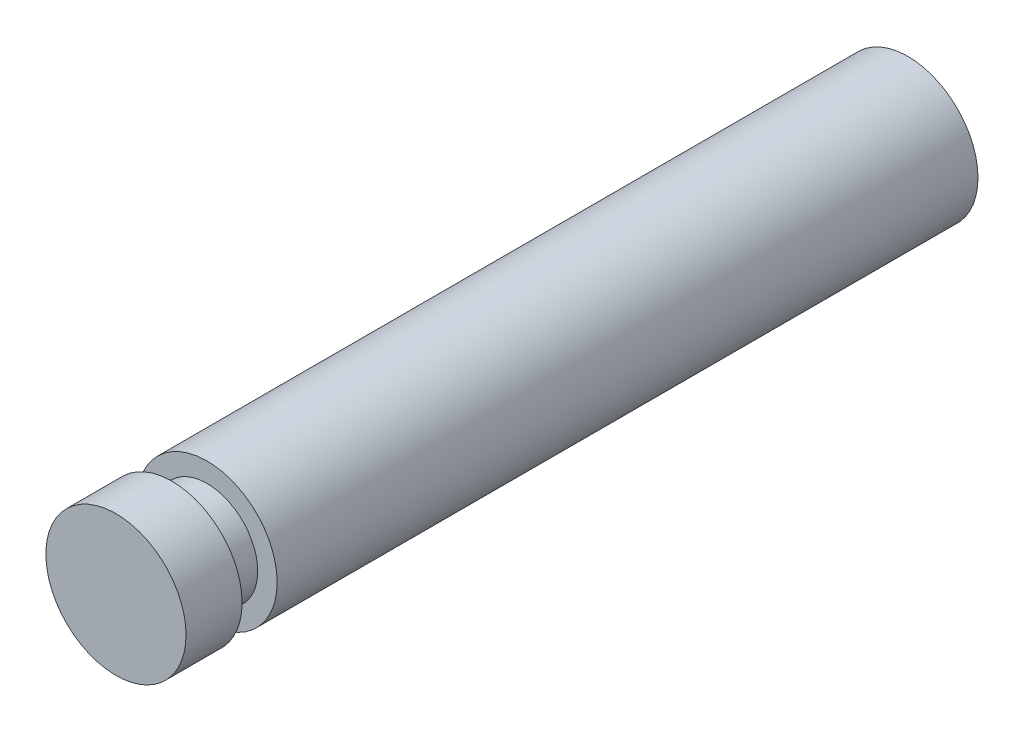
ISO-10303-21;
HEADER;
FILE_DESCRIPTION(('STEP AP214'),'2;1');
FILE_NAME('part.step','',(''),(''),'','','');
FILE_SCHEMA(('AUTOMOTIVE_DESIGN { 1 0 10303 214 1 1 1 1 }'));
ENDSEC;
DATA;
#1=APPLICATION_CONTEXT('core data for automotive mechanical design processes');
#2=APPLICATION_PROTOCOL_DEFINITION('international standard','automotive_design',2000,#1);
#3=PRODUCT_CONTEXT('',#1,'mechanical');
#4=PRODUCT('Part','Part','',(#3));
#5=PRODUCT_RELATED_PRODUCT_CATEGORY('part','',(#4));
#6=PRODUCT_DEFINITION_FORMATION('','',#4);
#7=PRODUCT_DEFINITION_CONTEXT('part definition',#1,'design');
#8=PRODUCT_DEFINITION('design','',#6,#7);
#9=PRODUCT_DEFINITION_SHAPE('','',#8);
#10=(LENGTH_UNIT() NAMED_UNIT(*) SI_UNIT(.MILLI.,.METRE.));
#11=(NAMED_UNIT(*) PLANE_ANGLE_UNIT() SI_UNIT($,.RADIAN.));
#12=(NAMED_UNIT(*) SI_UNIT($,.STERADIAN.) SOLID_ANGLE_UNIT());
#13=UNCERTAINTY_MEASURE_WITH_UNIT(LENGTH_MEASURE(1.E-05),#10,'distance_accuracy_value','');
#14=(GEOMETRIC_REPRESENTATION_CONTEXT(3) GLOBAL_UNCERTAINTY_ASSIGNED_CONTEXT((#13)) GLOBAL_UNIT_ASSIGNED_CONTEXT((#10,
#11,#12)) REPRESENTATION_CONTEXT('',''));
#15=CARTESIAN_POINT('',(0.,0.,0.));
#16=DIRECTION('',(0.,0.,1.));
#17=DIRECTION('',(1.,0.,0.));
#18=AXIS2_PLACEMENT_3D('',#15,#16,#17);
#19=CARTESIAN_POINT('',(0.,0.,10.));
#20=DIRECTION('',(0.,0.,-1.));
#21=DIRECTION('',(-1.,0.,0.));
#22=AXIS2_PLACEMENT_3D('',#19,#20,#21);
#23=CYLINDRICAL_SURFACE('',#22,1.);
#24=CARTESIAN_POINT('',(0.,0.,10.));
#25=DIRECTION('',(0.,0.,1.));
#26=DIRECTION('',(1.,0.,0.));
#27=AXIS2_PLACEMENT_3D('',#24,#25,#26);
#28=CIRCLE('',#27,1.);
#29=CARTESIAN_POINT('',(1.,0.,10.));
#30=VERTEX_POINT('',#29);
#31=EDGE_CURVE('E39',#30,#30,#28,.T.);
#32=ORIENTED_EDGE('',*,*,#31,.F.);
#33=EDGE_LOOP('',(#32));
#34=FACE_BOUND('',#33,.T.);
#35=CARTESIAN_POINT('',(0.,0.,0.));
#36=DIRECTION('',(0.,0.,1.));
#37=DIRECTION('',(1.,0.,0.));
#38=AXIS2_PLACEMENT_3D('',#35,#36,#37);
#39=CIRCLE('',#38,1.);
#40=CARTESIAN_POINT('',(1.,0.,0.));
#41=VERTEX_POINT('',#40);
#42=EDGE_CURVE('E35',#41,#41,#39,.T.);
#43=ORIENTED_EDGE('',*,*,#42,.T.);
#44=EDGE_LOOP('',(#43));
#45=FACE_BOUND('',#44,.T.);
#46=ADVANCED_FACE('F32',(#34,#45),#23,.T.);
#47=CARTESIAN_POINT('',(0.,0.,10.));
#48=DIRECTION('',(0.,0.,1.));
#49=DIRECTION('',(1.,0.,0.));
#50=AXIS2_PLACEMENT_3D('',#47,#48,#49);
#51=PLANE('',#50);
#52=CARTESIAN_POINT('',(0.,0.,10.));
#53=DIRECTION('',(0.,0.,1.));
#54=DIRECTION('',(1.,0.,0.));
#55=AXIS2_PLACEMENT_3D('',#52,#53,#54);
#56=CIRCLE('',#55,0.722538402544927);
#57=CARTESIAN_POINT('',(0.722538402544927,0.,10.));
#58=VERTEX_POINT('',#57);
#59=EDGE_CURVE('E10',#58,#58,#56,.T.);
#60=ORIENTED_EDGE('',*,*,#59,.F.);
#61=EDGE_LOOP('',(#60));
#62=FACE_BOUND('',#61,.T.);
#63=ORIENTED_EDGE('',*,*,#31,.T.);
#64=EDGE_LOOP('',(#63));
#65=FACE_BOUND('',#64,.T.);
#66=ADVANCED_FACE('F73',(#62,#65),#51,.T.);
#67=CARTESIAN_POINT('',(0.,0.,0.));
#68=DIRECTION('',(0.,0.,1.));
#69=DIRECTION('',(1.,0.,0.));
#70=AXIS2_PLACEMENT_3D('',#67,#68,#69);
#71=PLANE('',#70);
#72=ORIENTED_EDGE('',*,*,#42,.F.);
#73=EDGE_LOOP('',(#72));
#74=FACE_BOUND('',#73,.T.);
#75=ADVANCED_FACE('F78',(#74),#71,.F.);
#76=CARTESIAN_POINT('',(0.,0.,10.5));
#77=DIRECTION('',(0.,0.,-1.));
#78=DIRECTION('',(-1.,0.,0.));
#79=AXIS2_PLACEMENT_3D('',#76,#77,#78);
#80=CYLINDRICAL_SURFACE('',#79,0.722538402544927);
#81=CARTESIAN_POINT('',(0.,0.,10.5));
#82=DIRECTION('',(0.,0.,1.));
#83=DIRECTION('',(1.,0.,0.));
#84=AXIS2_PLACEMENT_3D('',#81,#82,#83);
#85=CIRCLE('',#84,0.722538402544927);
#86=CARTESIAN_POINT('',(0.722538402544927,0.,10.5));
#87=VERTEX_POINT('',#86);
#88=EDGE_CURVE('E45',#87,#87,#85,.T.);
#89=ORIENTED_EDGE('',*,*,#88,.F.);
#90=EDGE_LOOP('',(#89));
#91=FACE_BOUND('',#90,.T.);
#92=ORIENTED_EDGE('',*,*,#59,.T.);
#93=EDGE_LOOP('',(#92));
#94=FACE_BOUND('',#93,.T.);
#95=ADVANCED_FACE('F60',(#91,#94),#80,.T.);
#96=CARTESIAN_POINT('',(0.,0.,11.3));
#97=DIRECTION('',(0.,0.,-1.));
#98=DIRECTION('',(-1.,0.,0.));
#99=AXIS2_PLACEMENT_3D('',#96,#97,#98);
#100=CYLINDRICAL_SURFACE('',#99,1.);
#101=CARTESIAN_POINT('',(0.,0.,11.3));
#102=DIRECTION('',(0.,0.,1.));
#103=DIRECTION('',(1.,0.,0.));
#104=AXIS2_PLACEMENT_3D('',#101,#102,#103);
#105=CIRCLE('',#104,1.);
#106=CARTESIAN_POINT('',(1.,0.,11.3));
#107=VERTEX_POINT('',#106);
#108=EDGE_CURVE('E48',#107,#107,#105,.T.);
#109=ORIENTED_EDGE('',*,*,#108,.F.);
#110=EDGE_LOOP('',(#109));
#111=FACE_BOUND('',#110,.T.);
#112=CARTESIAN_POINT('',(0.,0.,10.5));
#113=DIRECTION('',(0.,0.,1.));
#114=DIRECTION('',(1.,0.,0.));
#115=AXIS2_PLACEMENT_3D('',#112,#113,#114);
#116=CIRCLE('',#115,1.);
#117=CARTESIAN_POINT('',(1.,0.,10.5));
#118=VERTEX_POINT('',#117);
#119=EDGE_CURVE('E49',#118,#118,#116,.T.);
#120=ORIENTED_EDGE('',*,*,#119,.T.);
#121=EDGE_LOOP('',(#120));
#122=FACE_BOUND('',#121,.T.);
#123=ADVANCED_FACE('F57',(#111,#122),#100,.T.);
#124=CARTESIAN_POINT('',(0.,0.,11.3));
#125=DIRECTION('',(0.,0.,1.));
#126=DIRECTION('',(1.,0.,0.));
#127=AXIS2_PLACEMENT_3D('',#124,#125,#126);
#128=PLANE('',#127);
#129=ORIENTED_EDGE('',*,*,#108,.T.);
#130=EDGE_LOOP('',(#129));
#131=FACE_BOUND('',#130,.T.);
#132=ADVANCED_FACE('F55',(#131),#128,.T.);
#133=CARTESIAN_POINT('',(0.,0.,10.5));
#134=DIRECTION('',(0.,0.,1.));
#135=DIRECTION('',(1.,0.,0.));
#136=AXIS2_PLACEMENT_3D('',#133,#134,#135);
#137=PLANE('',#136);
#138=ORIENTED_EDGE('',*,*,#88,.T.);
#139=EDGE_LOOP('',(#138));
#140=FACE_BOUND('',#139,.T.);
#141=ORIENTED_EDGE('',*,*,#119,.F.);
#142=EDGE_LOOP('',(#141));
#143=FACE_BOUND('',#142,.T.);
#144=ADVANCED_FACE('F64',(#140,#143),#137,.F.);
#145=CLOSED_SHELL('',(#46,#66,#75,#95,#123,#132,#144));
#146=MANIFOLD_SOLID_BREP('B2',#145);
#147=ADVANCED_BREP_SHAPE_REPRESENTATION('',(#18,#146),#14);
#148=SHAPE_DEFINITION_REPRESENTATION(#9,#147);
ENDSEC;
END-ISO-10303-21;
